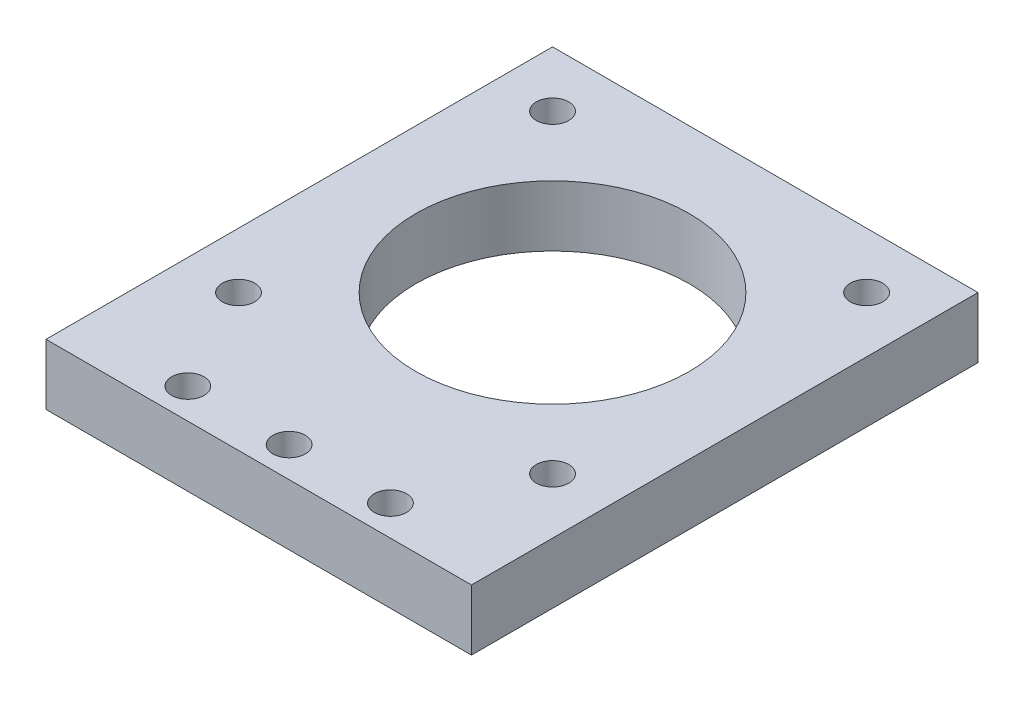
ISO-10303-21;
HEADER;
FILE_DESCRIPTION(('STEP AP214'),'2;1');
FILE_NAME('part.step','',(''),(''),'','','');
FILE_SCHEMA(('AUTOMOTIVE_DESIGN { 1 0 10303 214 1 1 1 1 }'));
ENDSEC;
DATA;
#1=APPLICATION_CONTEXT('core data for automotive mechanical design processes');
#2=APPLICATION_PROTOCOL_DEFINITION('international standard','automotive_design',2000,#1);
#3=PRODUCT_CONTEXT('',#1,'mechanical');
#4=PRODUCT('Part','Part','',(#3));
#5=PRODUCT_RELATED_PRODUCT_CATEGORY('part','',(#4));
#6=PRODUCT_DEFINITION_FORMATION('','',#4);
#7=PRODUCT_DEFINITION_CONTEXT('part definition',#1,'design');
#8=PRODUCT_DEFINITION('design','',#6,#7);
#9=PRODUCT_DEFINITION_SHAPE('','',#8);
#10=(LENGTH_UNIT() NAMED_UNIT(*) SI_UNIT(.MILLI.,.METRE.));
#11=(NAMED_UNIT(*) PLANE_ANGLE_UNIT() SI_UNIT($,.RADIAN.));
#12=(NAMED_UNIT(*) SI_UNIT($,.STERADIAN.) SOLID_ANGLE_UNIT());
#13=UNCERTAINTY_MEASURE_WITH_UNIT(LENGTH_MEASURE(1.E-05),#10,'distance_accuracy_value','');
#14=(GEOMETRIC_REPRESENTATION_CONTEXT(3) GLOBAL_UNCERTAINTY_ASSIGNED_CONTEXT((#13)) GLOBAL_UNIT_ASSIGNED_CONTEXT((#10,
#11,#12)) REPRESENTATION_CONTEXT('',''));
#15=CARTESIAN_POINT('',(0.,0.,0.));
#16=DIRECTION('',(0.,0.,1.));
#17=DIRECTION('',(1.,0.,0.));
#18=AXIS2_PLACEMENT_3D('',#15,#16,#17);
#19=CARTESIAN_POINT('',(0.,6.,0.));
#20=DIRECTION('',(0.,0.,-1.));
#21=DIRECTION('',(-1.,0.,0.));
#22=AXIS2_PLACEMENT_3D('',#19,#20,#21);
#23=PLANE('',#22);
#24=DIRECTION('',(1.,0.,0.));
#25=VECTOR('',#24,1.);
#26=CARTESIAN_POINT('',(0.,0.,0.));
#27=LINE('',#26,#25);
#28=CARTESIAN_POINT('',(0.,0.,0.));
#29=VERTEX_POINT('',#28);
#30=CARTESIAN_POINT('',(42.,0.,0.));
#31=VERTEX_POINT('',#30);
#32=EDGE_CURVE('E129',#29,#31,#27,.T.);
#33=ORIENTED_EDGE('',*,*,#32,.T.);
#34=DIRECTION('',(0.,-1.,0.));
#35=VECTOR('',#34,1.);
#36=CARTESIAN_POINT('',(42.,6.,0.));
#37=LINE('',#36,#35);
#38=CARTESIAN_POINT('',(42.,6.,0.));
#39=VERTEX_POINT('',#38);
#40=EDGE_CURVE('E11',#39,#31,#37,.T.);
#41=ORIENTED_EDGE('',*,*,#40,.F.);
#42=DIRECTION('',(1.,0.,0.));
#43=VECTOR('',#42,1.);
#44=CARTESIAN_POINT('',(0.,6.,0.));
#45=LINE('',#44,#43);
#46=CARTESIAN_POINT('',(0.,6.,0.));
#47=VERTEX_POINT('',#46);
#48=EDGE_CURVE('E91',#47,#39,#45,.T.);
#49=ORIENTED_EDGE('',*,*,#48,.F.);
#50=DIRECTION('',(0.,-1.,0.));
#51=VECTOR('',#50,1.);
#52=CARTESIAN_POINT('',(0.,6.,0.));
#53=LINE('',#52,#51);
#54=EDGE_CURVE('E57',#47,#29,#53,.T.);
#55=ORIENTED_EDGE('',*,*,#54,.T.);
#56=EDGE_LOOP('',(#33,#41,#49,#55));
#57=FACE_BOUND('',#56,.T.);
#58=ADVANCED_FACE('F40',(#57),#23,.F.);
#59=CARTESIAN_POINT('',(42.,6.,0.));
#60=DIRECTION('',(-1.,0.,0.));
#61=DIRECTION('',(0.,0.,1.));
#62=AXIS2_PLACEMENT_3D('',#59,#60,#61);
#63=PLANE('',#62);
#64=DIRECTION('',(0.,0.,-1.));
#65=VECTOR('',#64,1.);
#66=CARTESIAN_POINT('',(42.,0.,0.));
#67=LINE('',#66,#65);
#68=CARTESIAN_POINT('',(42.,0.,-50.));
#69=VERTEX_POINT('',#68);
#70=EDGE_CURVE('E96',#31,#69,#67,.T.);
#71=ORIENTED_EDGE('',*,*,#70,.T.);
#72=DIRECTION('',(0.,-1.,0.));
#73=VECTOR('',#72,1.);
#74=CARTESIAN_POINT('',(42.,6.,-50.));
#75=LINE('',#74,#73);
#76=CARTESIAN_POINT('',(42.,6.,-50.));
#77=VERTEX_POINT('',#76);
#78=EDGE_CURVE('E49',#77,#69,#75,.T.);
#79=ORIENTED_EDGE('',*,*,#78,.F.);
#80=DIRECTION('',(0.,0.,-1.));
#81=VECTOR('',#80,1.);
#82=CARTESIAN_POINT('',(42.,6.,0.));
#83=LINE('',#82,#81);
#84=EDGE_CURVE('E82',#39,#77,#83,.T.);
#85=ORIENTED_EDGE('',*,*,#84,.F.);
#86=ORIENTED_EDGE('',*,*,#40,.T.);
#87=EDGE_LOOP('',(#71,#79,#85,#86));
#88=FACE_BOUND('',#87,.T.);
#89=ADVANCED_FACE('F95',(#88),#63,.F.);
#90=CARTESIAN_POINT('',(0.,6.,-50.));
#91=DIRECTION('',(0.,0.,-1.));
#92=DIRECTION('',(-1.,0.,0.));
#93=AXIS2_PLACEMENT_3D('',#90,#91,#92);
#94=PLANE('',#93);
#95=DIRECTION('',(1.,0.,0.));
#96=VECTOR('',#95,1.);
#97=CARTESIAN_POINT('',(0.,0.,-50.));
#98=LINE('',#97,#96);
#99=CARTESIAN_POINT('',(0.,0.,-50.));
#100=VERTEX_POINT('',#99);
#101=EDGE_CURVE('E132',#100,#69,#98,.T.);
#102=ORIENTED_EDGE('',*,*,#101,.F.);
#103=DIRECTION('',(0.,-1.,0.));
#104=VECTOR('',#103,1.);
#105=CARTESIAN_POINT('',(0.,6.,-50.));
#106=LINE('',#105,#104);
#107=CARTESIAN_POINT('',(0.,6.,-50.));
#108=VERTEX_POINT('',#107);
#109=EDGE_CURVE('E71',#108,#100,#106,.T.);
#110=ORIENTED_EDGE('',*,*,#109,.F.);
#111=DIRECTION('',(1.,0.,0.));
#112=VECTOR('',#111,1.);
#113=CARTESIAN_POINT('',(0.,6.,-50.));
#114=LINE('',#113,#112);
#115=EDGE_CURVE('E90',#108,#77,#114,.T.);
#116=ORIENTED_EDGE('',*,*,#115,.T.);
#117=ORIENTED_EDGE('',*,*,#78,.T.);
#118=EDGE_LOOP('',(#102,#110,#116,#117));
#119=FACE_BOUND('',#118,.T.);
#120=ADVANCED_FACE('F99',(#119),#94,.T.);
#121=CARTESIAN_POINT('',(36.5,6.,-13.5));
#122=DIRECTION('',(0.,-1.,0.));
#123=DIRECTION('',(0.,0.,-1.));
#124=AXIS2_PLACEMENT_3D('',#121,#122,#123);
#125=CYLINDRICAL_SURFACE('',#124,1.6);
#126=CARTESIAN_POINT('',(36.5,6.,-13.5));
#127=DIRECTION('',(0.,1.,0.));
#128=DIRECTION('',(0.,0.,1.));
#129=AXIS2_PLACEMENT_3D('',#126,#127,#128);
#130=CIRCLE('',#129,1.6);
#131=CARTESIAN_POINT('',(36.5,6.,-11.9));
#132=VERTEX_POINT('',#131);
#133=EDGE_CURVE('E111',#132,#132,#130,.T.);
#134=ORIENTED_EDGE('',*,*,#133,.T.);
#135=EDGE_LOOP('',(#134));
#136=FACE_BOUND('',#135,.T.);
#137=CARTESIAN_POINT('',(36.5,0.,-13.5));
#138=DIRECTION('',(0.,1.,0.));
#139=DIRECTION('',(0.,0.,1.));
#140=AXIS2_PLACEMENT_3D('',#137,#138,#139);
#141=CIRCLE('',#140,1.6);
#142=CARTESIAN_POINT('',(36.5,0.,-11.9));
#143=VERTEX_POINT('',#142);
#144=EDGE_CURVE('E143',#143,#143,#141,.T.);
#145=ORIENTED_EDGE('',*,*,#144,.F.);
#146=EDGE_LOOP('',(#145));
#147=FACE_BOUND('',#146,.T.);
#148=ADVANCED_FACE('F222',(#136,#147),#125,.F.);
#149=CARTESIAN_POINT('',(11.,6.,-3.));
#150=DIRECTION('',(0.,-1.,0.));
#151=DIRECTION('',(0.,0.,-1.));
#152=AXIS2_PLACEMENT_3D('',#149,#150,#151);
#153=CYLINDRICAL_SURFACE('',#152,1.6);
#154=CARTESIAN_POINT('',(11.,6.,-3.));
#155=DIRECTION('',(0.,1.,0.));
#156=DIRECTION('',(0.,0.,1.));
#157=AXIS2_PLACEMENT_3D('',#154,#155,#156);
#158=CIRCLE('',#157,1.6);
#159=CARTESIAN_POINT('',(11.,6.,-1.4));
#160=VERTEX_POINT('',#159);
#161=EDGE_CURVE('E108',#160,#160,#158,.T.);
#162=ORIENTED_EDGE('',*,*,#161,.T.);
#163=EDGE_LOOP('',(#162));
#164=FACE_BOUND('',#163,.T.);
#165=CARTESIAN_POINT('',(11.,0.,-3.));
#166=DIRECTION('',(0.,1.,0.));
#167=DIRECTION('',(0.,0.,1.));
#168=AXIS2_PLACEMENT_3D('',#165,#166,#167);
#169=CIRCLE('',#168,1.6);
#170=CARTESIAN_POINT('',(11.,0.,-1.4));
#171=VERTEX_POINT('',#170);
#172=EDGE_CURVE('E140',#171,#171,#169,.T.);
#173=ORIENTED_EDGE('',*,*,#172,.F.);
#174=EDGE_LOOP('',(#173));
#175=FACE_BOUND('',#174,.T.);
#176=ADVANCED_FACE('F224',(#164,#175),#153,.F.);
#177=CARTESIAN_POINT('',(31.,6.,-3.));
#178=DIRECTION('',(0.,-1.,0.));
#179=DIRECTION('',(0.,0.,-1.));
#180=AXIS2_PLACEMENT_3D('',#177,#178,#179);
#181=CYLINDRICAL_SURFACE('',#180,1.6);
#182=CARTESIAN_POINT('',(31.,6.,-3.));
#183=DIRECTION('',(0.,1.,0.));
#184=DIRECTION('',(0.,0.,1.));
#185=AXIS2_PLACEMENT_3D('',#182,#183,#184);
#186=CIRCLE('',#185,1.6);
#187=CARTESIAN_POINT('',(31.,6.,-1.4));
#188=VERTEX_POINT('',#187);
#189=EDGE_CURVE('E102',#188,#188,#186,.T.);
#190=ORIENTED_EDGE('',*,*,#189,.T.);
#191=EDGE_LOOP('',(#190));
#192=FACE_BOUND('',#191,.T.);
#193=CARTESIAN_POINT('',(31.,0.,-3.));
#194=DIRECTION('',(0.,1.,0.));
#195=DIRECTION('',(0.,0.,1.));
#196=AXIS2_PLACEMENT_3D('',#193,#194,#195);
#197=CIRCLE('',#196,1.6);
#198=CARTESIAN_POINT('',(31.,0.,-1.4));
#199=VERTEX_POINT('',#198);
#200=EDGE_CURVE('E137',#199,#199,#197,.T.);
#201=ORIENTED_EDGE('',*,*,#200,.F.);
#202=EDGE_LOOP('',(#201));
#203=FACE_BOUND('',#202,.T.);
#204=ADVANCED_FACE('F231',(#192,#203),#181,.F.);
#205=CARTESIAN_POINT('',(0.,6.,0.));
#206=DIRECTION('',(-1.,0.,0.));
#207=DIRECTION('',(0.,0.,1.));
#208=AXIS2_PLACEMENT_3D('',#205,#206,#207);
#209=PLANE('',#208);
#210=DIRECTION('',(0.,0.,-1.));
#211=VECTOR('',#210,1.);
#212=CARTESIAN_POINT('',(0.,0.,0.));
#213=LINE('',#212,#211);
#214=EDGE_CURVE('E134',#29,#100,#213,.T.);
#215=ORIENTED_EDGE('',*,*,#214,.F.);
#216=ORIENTED_EDGE('',*,*,#54,.F.);
#217=DIRECTION('',(0.,0.,-1.));
#218=VECTOR('',#217,1.);
#219=CARTESIAN_POINT('',(0.,6.,0.));
#220=LINE('',#219,#218);
#221=EDGE_CURVE('E100',#47,#108,#220,.T.);
#222=ORIENTED_EDGE('',*,*,#221,.T.);
#223=ORIENTED_EDGE('',*,*,#109,.T.);
#224=EDGE_LOOP('',(#215,#216,#222,#223));
#225=FACE_BOUND('',#224,.T.);
#226=ADVANCED_FACE('F196',(#225),#209,.T.);
#227=CARTESIAN_POINT('',(21.,6.,-3.));
#228=DIRECTION('',(0.,-1.,0.));
#229=DIRECTION('',(0.,0.,-1.));
#230=AXIS2_PLACEMENT_3D('',#227,#228,#229);
#231=CYLINDRICAL_SURFACE('',#230,1.6);
#232=CARTESIAN_POINT('',(21.,6.,-3.));
#233=DIRECTION('',(0.,1.,0.));
#234=DIRECTION('',(0.,0.,1.));
#235=AXIS2_PLACEMENT_3D('',#232,#233,#234);
#236=CIRCLE('',#235,1.6);
#237=CARTESIAN_POINT('',(21.,6.,-1.4));
#238=VERTEX_POINT('',#237);
#239=EDGE_CURVE('E164',#238,#238,#236,.T.);
#240=ORIENTED_EDGE('',*,*,#239,.T.);
#241=EDGE_LOOP('',(#240));
#242=FACE_BOUND('',#241,.T.);
#243=CARTESIAN_POINT('',(21.,0.,-3.));
#244=DIRECTION('',(0.,1.,0.));
#245=DIRECTION('',(0.,0.,1.));
#246=AXIS2_PLACEMENT_3D('',#243,#244,#245);
#247=CIRCLE('',#246,1.6);
#248=CARTESIAN_POINT('',(21.,0.,-1.4));
#249=VERTEX_POINT('',#248);
#250=EDGE_CURVE('E126',#249,#249,#247,.T.);
#251=ORIENTED_EDGE('',*,*,#250,.F.);
#252=EDGE_LOOP('',(#251));
#253=FACE_BOUND('',#252,.T.);
#254=ADVANCED_FACE('F168',(#242,#253),#231,.F.);
#255=CARTESIAN_POINT('',(5.5,6.,-44.5));
#256=DIRECTION('',(0.,-1.,0.));
#257=DIRECTION('',(0.,0.,-1.));
#258=AXIS2_PLACEMENT_3D('',#255,#256,#257);
#259=CYLINDRICAL_SURFACE('',#258,1.6);
#260=CARTESIAN_POINT('',(5.5,6.,-44.5));
#261=DIRECTION('',(0.,1.,0.));
#262=DIRECTION('',(0.,0.,1.));
#263=AXIS2_PLACEMENT_3D('',#260,#261,#262);
#264=CIRCLE('',#263,1.6);
#265=CARTESIAN_POINT('',(5.5,6.,-42.9));
#266=VERTEX_POINT('',#265);
#267=EDGE_CURVE('E159',#266,#266,#264,.T.);
#268=ORIENTED_EDGE('',*,*,#267,.T.);
#269=EDGE_LOOP('',(#268));
#270=FACE_BOUND('',#269,.T.);
#271=CARTESIAN_POINT('',(5.5,0.,-44.5));
#272=DIRECTION('',(0.,1.,0.));
#273=DIRECTION('',(0.,0.,1.));
#274=AXIS2_PLACEMENT_3D('',#271,#272,#273);
#275=CIRCLE('',#274,1.6);
#276=CARTESIAN_POINT('',(5.5,0.,-42.9));
#277=VERTEX_POINT('',#276);
#278=EDGE_CURVE('E123',#277,#277,#275,.T.);
#279=ORIENTED_EDGE('',*,*,#278,.F.);
#280=EDGE_LOOP('',(#279));
#281=FACE_BOUND('',#280,.T.);
#282=ADVANCED_FACE('F195',(#270,#281),#259,.F.);
#283=CARTESIAN_POINT('',(36.5,6.,-44.5));
#284=DIRECTION('',(0.,-1.,0.));
#285=DIRECTION('',(0.,0.,-1.));
#286=AXIS2_PLACEMENT_3D('',#283,#284,#285);
#287=CYLINDRICAL_SURFACE('',#286,1.6);
#288=CARTESIAN_POINT('',(36.5,6.,-44.5));
#289=DIRECTION('',(0.,1.,0.));
#290=DIRECTION('',(0.,0.,1.));
#291=AXIS2_PLACEMENT_3D('',#288,#289,#290);
#292=CIRCLE('',#291,1.6);
#293=CARTESIAN_POINT('',(36.5,6.,-42.9));
#294=VERTEX_POINT('',#293);
#295=EDGE_CURVE('E154',#294,#294,#292,.F.);
#296=ORIENTED_EDGE('',*,*,#295,.F.);
#297=EDGE_LOOP('',(#296));
#298=FACE_BOUND('',#297,.T.);
#299=CARTESIAN_POINT('',(36.5,0.,-44.5));
#300=DIRECTION('',(0.,1.,0.));
#301=DIRECTION('',(0.,0.,1.));
#302=AXIS2_PLACEMENT_3D('',#299,#300,#301);
#303=CIRCLE('',#302,1.6);
#304=CARTESIAN_POINT('',(36.5,0.,-42.9));
#305=VERTEX_POINT('',#304);
#306=EDGE_CURVE('E120',#305,#305,#303,.F.);
#307=ORIENTED_EDGE('',*,*,#306,.T.);
#308=EDGE_LOOP('',(#307));
#309=FACE_BOUND('',#308,.T.);
#310=ADVANCED_FACE('F198',(#298,#309),#287,.F.);
#311=CARTESIAN_POINT('',(20.9999999999933,6.,-28.9999999999982));
#312=DIRECTION('',(0.,-1.,0.));
#313=DIRECTION('',(0.,0.,-1.));
#314=AXIS2_PLACEMENT_3D('',#311,#312,#313);
#315=CYLINDRICAL_SURFACE('',#314,13.5);
#316=CARTESIAN_POINT('',(20.9999999999933,6.,-28.9999999999982));
#317=DIRECTION('',(0.,1.,0.));
#318=DIRECTION('',(0.,0.,1.));
#319=AXIS2_PLACEMENT_3D('',#316,#317,#318);
#320=CIRCLE('',#319,13.5);
#321=CARTESIAN_POINT('',(20.9999999999933,6.,-15.4999999999982));
#322=VERTEX_POINT('',#321);
#323=EDGE_CURVE('E149',#322,#322,#320,.T.);
#324=ORIENTED_EDGE('',*,*,#323,.T.);
#325=EDGE_LOOP('',(#324));
#326=FACE_BOUND('',#325,.T.);
#327=CARTESIAN_POINT('',(20.9999999999933,0.,-28.9999999999982));
#328=DIRECTION('',(0.,1.,0.));
#329=DIRECTION('',(0.,0.,1.));
#330=AXIS2_PLACEMENT_3D('',#327,#328,#329);
#331=CIRCLE('',#330,13.5);
#332=CARTESIAN_POINT('',(20.9999999999933,0.,-15.4999999999982));
#333=VERTEX_POINT('',#332);
#334=EDGE_CURVE('E117',#333,#333,#331,.T.);
#335=ORIENTED_EDGE('',*,*,#334,.F.);
#336=EDGE_LOOP('',(#335));
#337=FACE_BOUND('',#336,.T.);
#338=ADVANCED_FACE('F42',(#326,#337),#315,.F.);
#339=CARTESIAN_POINT('',(5.5,6.,-13.5));
#340=DIRECTION('',(0.,-1.,0.));
#341=DIRECTION('',(0.,0.,-1.));
#342=AXIS2_PLACEMENT_3D('',#339,#340,#341);
#343=CYLINDRICAL_SURFACE('',#342,1.6);
#344=CARTESIAN_POINT('',(5.5,6.,-13.5));
#345=DIRECTION('',(0.,1.,0.));
#346=DIRECTION('',(0.,0.,1.));
#347=AXIS2_PLACEMENT_3D('',#344,#345,#346);
#348=CIRCLE('',#347,1.6);
#349=CARTESIAN_POINT('',(5.5,6.,-11.9));
#350=VERTEX_POINT('',#349);
#351=EDGE_CURVE('E114',#350,#350,#348,.F.);
#352=ORIENTED_EDGE('',*,*,#351,.F.);
#353=EDGE_LOOP('',(#352));
#354=FACE_BOUND('',#353,.T.);
#355=CARTESIAN_POINT('',(5.5,0.,-13.5));
#356=DIRECTION('',(0.,1.,0.));
#357=DIRECTION('',(0.,0.,1.));
#358=AXIS2_PLACEMENT_3D('',#355,#356,#357);
#359=CIRCLE('',#358,1.6);
#360=CARTESIAN_POINT('',(5.5,0.,-11.9));
#361=VERTEX_POINT('',#360);
#362=EDGE_CURVE('E146',#361,#361,#359,.F.);
#363=ORIENTED_EDGE('',*,*,#362,.T.);
#364=EDGE_LOOP('',(#363));
#365=FACE_BOUND('',#364,.T.);
#366=ADVANCED_FACE('F173',(#354,#365),#343,.F.);
#367=CARTESIAN_POINT('',(0.,6.,0.));
#368=DIRECTION('',(0.,1.,0.));
#369=DIRECTION('',(0.,0.,1.));
#370=AXIS2_PLACEMENT_3D('',#367,#368,#369);
#371=PLANE('',#370);
#372=ORIENTED_EDGE('',*,*,#323,.F.);
#373=EDGE_LOOP('',(#372));
#374=FACE_BOUND('',#373,.T.);
#375=ORIENTED_EDGE('',*,*,#295,.T.);
#376=EDGE_LOOP('',(#375));
#377=FACE_BOUND('',#376,.T.);
#378=ORIENTED_EDGE('',*,*,#267,.F.);
#379=EDGE_LOOP('',(#378));
#380=FACE_BOUND('',#379,.T.);
#381=ORIENTED_EDGE('',*,*,#239,.F.);
#382=EDGE_LOOP('',(#381));
#383=FACE_BOUND('',#382,.T.);
#384=ORIENTED_EDGE('',*,*,#48,.T.);
#385=ORIENTED_EDGE('',*,*,#84,.T.);
#386=ORIENTED_EDGE('',*,*,#115,.F.);
#387=ORIENTED_EDGE('',*,*,#221,.F.);
#388=EDGE_LOOP('',(#384,#385,#386,#387));
#389=FACE_BOUND('',#388,.T.);
#390=ORIENTED_EDGE('',*,*,#189,.F.);
#391=EDGE_LOOP('',(#390));
#392=FACE_BOUND('',#391,.T.);
#393=ORIENTED_EDGE('',*,*,#161,.F.);
#394=EDGE_LOOP('',(#393));
#395=FACE_BOUND('',#394,.T.);
#396=ORIENTED_EDGE('',*,*,#133,.F.);
#397=EDGE_LOOP('',(#396));
#398=FACE_BOUND('',#397,.T.);
#399=ORIENTED_EDGE('',*,*,#351,.T.);
#400=EDGE_LOOP('',(#399));
#401=FACE_BOUND('',#400,.T.);
#402=ADVANCED_FACE('F86',(#374,#377,#380,#383,#389,#392,#395,#398,#401),#371,.T.);
#403=CARTESIAN_POINT('',(0.,0.,0.));
#404=DIRECTION('',(0.,1.,0.));
#405=DIRECTION('',(0.,0.,1.));
#406=AXIS2_PLACEMENT_3D('',#403,#404,#405);
#407=PLANE('',#406);
#408=ORIENTED_EDGE('',*,*,#334,.T.);
#409=EDGE_LOOP('',(#408));
#410=FACE_BOUND('',#409,.T.);
#411=ORIENTED_EDGE('',*,*,#306,.F.);
#412=EDGE_LOOP('',(#411));
#413=FACE_BOUND('',#412,.T.);
#414=ORIENTED_EDGE('',*,*,#278,.T.);
#415=EDGE_LOOP('',(#414));
#416=FACE_BOUND('',#415,.T.);
#417=ORIENTED_EDGE('',*,*,#250,.T.);
#418=EDGE_LOOP('',(#417));
#419=FACE_BOUND('',#418,.T.);
#420=ORIENTED_EDGE('',*,*,#32,.F.);
#421=ORIENTED_EDGE('',*,*,#214,.T.);
#422=ORIENTED_EDGE('',*,*,#101,.T.);
#423=ORIENTED_EDGE('',*,*,#70,.F.);
#424=EDGE_LOOP('',(#420,#421,#422,#423));
#425=FACE_BOUND('',#424,.T.);
#426=ORIENTED_EDGE('',*,*,#200,.T.);
#427=EDGE_LOOP('',(#426));
#428=FACE_BOUND('',#427,.T.);
#429=ORIENTED_EDGE('',*,*,#172,.T.);
#430=EDGE_LOOP('',(#429));
#431=FACE_BOUND('',#430,.T.);
#432=ORIENTED_EDGE('',*,*,#144,.T.);
#433=EDGE_LOOP('',(#432));
#434=FACE_BOUND('',#433,.T.);
#435=ORIENTED_EDGE('',*,*,#362,.F.);
#436=EDGE_LOOP('',(#435));
#437=FACE_BOUND('',#436,.T.);
#438=ADVANCED_FACE('F172',(#410,#413,#416,#419,#425,#428,#431,#434,#437),#407,.F.);
#439=CLOSED_SHELL('',(#58,#89,#120,#148,#176,#204,#226,#254,#282,#310,#338,#366,#402,#438));
#440=MANIFOLD_SOLID_BREP('B2',#439);
#441=ADVANCED_BREP_SHAPE_REPRESENTATION('',(#18,#440),#14);
#442=SHAPE_DEFINITION_REPRESENTATION(#9,#441);
ENDSEC;
END-ISO-10303-21;
